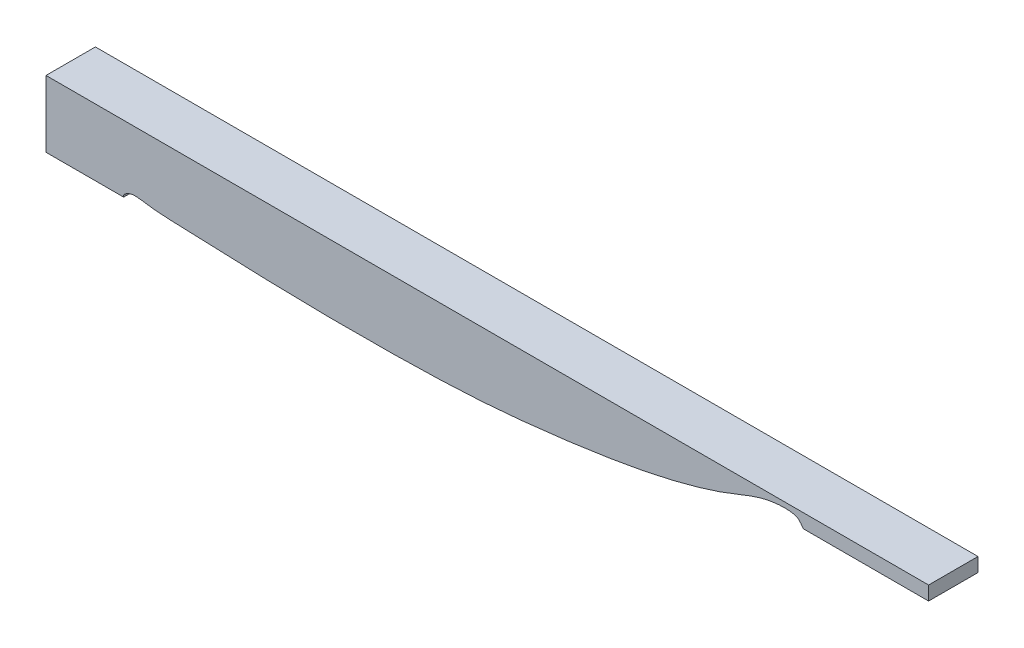
ISO-10303-21;
HEADER;
FILE_DESCRIPTION(('STEP AP214'),'2;1');
FILE_NAME('part.step','',(''),(''),'','','');
FILE_SCHEMA(('AUTOMOTIVE_DESIGN { 1 0 10303 214 1 1 1 1 }'));
ENDSEC;
DATA;
#1=APPLICATION_CONTEXT('core data for automotive mechanical design processes');
#2=APPLICATION_PROTOCOL_DEFINITION('international standard','automotive_design',2000,#1);
#3=PRODUCT_CONTEXT('',#1,'mechanical');
#4=PRODUCT('Part','Part','',(#3));
#5=PRODUCT_RELATED_PRODUCT_CATEGORY('part','',(#4));
#6=PRODUCT_DEFINITION_FORMATION('','',#4);
#7=PRODUCT_DEFINITION_CONTEXT('part definition',#1,'design');
#8=PRODUCT_DEFINITION('design','',#6,#7);
#9=PRODUCT_DEFINITION_SHAPE('','',#8);
#10=(LENGTH_UNIT() NAMED_UNIT(*) SI_UNIT(.MILLI.,.METRE.));
#11=(NAMED_UNIT(*) PLANE_ANGLE_UNIT() SI_UNIT($,.RADIAN.));
#12=(NAMED_UNIT(*) SI_UNIT($,.STERADIAN.) SOLID_ANGLE_UNIT());
#13=UNCERTAINTY_MEASURE_WITH_UNIT(LENGTH_MEASURE(1.E-05),#10,'distance_accuracy_value','');
#14=(GEOMETRIC_REPRESENTATION_CONTEXT(3) GLOBAL_UNCERTAINTY_ASSIGNED_CONTEXT((#13)) GLOBAL_UNIT_ASSIGNED_CONTEXT((#10,
#11,#12)) REPRESENTATION_CONTEXT('',''));
#15=CARTESIAN_POINT('',(0.,0.,0.));
#16=DIRECTION('',(0.,0.,1.));
#17=DIRECTION('',(1.,0.,0.));
#18=AXIS2_PLACEMENT_3D('',#15,#16,#17);
#19=CARTESIAN_POINT('',(-68.2489484839727,-8.52605292965796,476.));
#20=CARTESIAN_POINT('',(-68.2533247923052,-8.4529023843003,476.));
#21=CARTESIAN_POINT('',(-68.2569322805552,-8.37972342049867,476.));
#22=CARTESIAN_POINT('',(-68.2343163521224,-8.23226283192259,476.));
#23=CARTESIAN_POINT('',(-68.2080207293459,-8.16138844231768,476.));
#24=CARTESIAN_POINT('',(-68.127205135676,-8.03800988249847,476.));
#25=CARTESIAN_POINT('',(-68.0705011138666,-7.98776429052485,476.));
#26=CARTESIAN_POINT('',(-67.9482158781483,-7.90493004226665,476.));
#27=CARTESIAN_POINT('',(-67.884204442002,-7.86774868673432,476.));
#28=CARTESIAN_POINT('',(-67.5668208352467,-7.67825343060356,476.));
#29=CARTESIAN_POINT('',(-67.2971203980184,-7.54852209465641,476.));
#30=CARTESIAN_POINT('',(-66.7315049901243,-7.42235765275631,476.));
#31=CARTESIAN_POINT('',(-66.4339173476953,-7.41421867884997,476.));
#32=CARTESIAN_POINT('',(-65.8491519753092,-7.4418418646999,476.));
#33=CARTESIAN_POINT('',(-65.5583082346722,-7.47586883696786,476.));
#34=CARTESIAN_POINT('',(-64.9776596182763,-7.55756916912911,476.));
#35=CARTESIAN_POINT('',(-64.6878259473411,-7.60558858902924,476.));
#36=CARTESIAN_POINT('',(-64.1073487239561,-7.68947349176511,476.));
#37=CARTESIAN_POINT('',(-63.8167773241377,-7.72625422834563,476.));
#38=CARTESIAN_POINT('',(-62.9441617010869,-7.82261489506019,476.));
#39=CARTESIAN_POINT('',(-62.3611726505844,-7.86754006887502,476.));
#40=CARTESIAN_POINT('',(-61.1937781088705,-7.93542069348066,476.));
#41=CARTESIAN_POINT('',(-60.6095243307638,-7.96072929246214,476.));
#42=CARTESIAN_POINT('',(-59.4410020774088,-8.01111853020813,476.));
#43=CARTESIAN_POINT('',(-58.8567673535564,-8.03672267046187,476.));
#44=CARTESIAN_POINT('',(-57.1038410778341,-8.11009014152662,476.));
#45=CARTESIAN_POINT('',(-55.9349310917602,-8.15448744910708,476.));
#46=CARTESIAN_POINT('',(-52.4281269451959,-8.28639460573356,476.));
#47=CARTESIAN_POINT('',(-50.0901506244311,-8.37165275997234,476.));
#48=CARTESIAN_POINT('',(-45.4136421465843,-8.52564087746645,476.));
#49=CARTESIAN_POINT('',(-43.0750931348111,-8.59424462831321,476.));
#50=CARTESIAN_POINT('',(-38.3971672172672,-8.6947301961758,476.));
#51=CARTESIAN_POINT('',(-36.0579224010292,-8.72610347480661,476.));
#52=CARTESIAN_POINT('',(-31.3799470134702,-8.74952805701792,476.));
#53=CARTESIAN_POINT('',(-29.04105756508,-8.74229627148272,476.));
#54=CARTESIAN_POINT('',(-24.3634389426365,-8.69692794912191,476.));
#55=CARTESIAN_POINT('',(-22.0247086278698,-8.65901136930994,476.));
#56=CARTESIAN_POINT('',(-17.3474943370252,-8.53567817904545,476.));
#57=CARTESIAN_POINT('',(-15.0095135558156,-8.44877289023829,476.));
#58=CARTESIAN_POINT('',(-10.3385677126265,-8.19096370774135,476.));
#59=CARTESIAN_POINT('',(-8.00466935444032,-8.01945498111064,476.));
#60=CARTESIAN_POINT('',(-3.34540906826943,-7.59507370090841,476.));
#61=CARTESIAN_POINT('',(-1.01975021087461,-7.34413874672655,476.));
#62=CARTESIAN_POINT('',(3.62547515267916,-6.78283116800662,476.));
#63=CARTESIAN_POINT('',(5.94419277189459,-6.471592694492,476.));
#64=CARTESIAN_POINT('',(10.5707880283356,-5.77839263563608,476.));
#65=CARTESIAN_POINT('',(12.8803568834181,-5.39819157328985,476.));
#66=CARTESIAN_POINT('',(16.326183490577,-4.74214811288934,476.));
#67=CARTESIAN_POINT('',(17.4716503896121,-4.50866132848567,476.));
#68=CARTESIAN_POINT('',(19.7546149284383,-4.00413491527338,476.));
#69=CARTESIAN_POINT('',(20.8920173015602,-3.73264636965838,476.));
#70=CARTESIAN_POINT('',(23.1586602693669,-3.15120924264154,476.));
#71=CARTESIAN_POINT('',(24.2870475885936,-2.8420202123151,476.));
#72=CARTESIAN_POINT('',(26.5262576086589,-2.17443590813453,476.));
#73=CARTESIAN_POINT('',(27.6373844588649,-1.81531806968745,476.));
#74=CARTESIAN_POINT('',(29.285467265012,-1.22105767859637,476.));
#75=CARTESIAN_POINT('',(29.8318705434838,-1.01413586396761,476.));
#76=CARTESIAN_POINT('',(30.9215346744231,-0.590905280818656,476.));
#77=CARTESIAN_POINT('',(31.4642750736003,-0.373041830968047,476.));
#78=CARTESIAN_POINT('',(33.0959248206747,0.270306865659442,476.));
#79=CARTESIAN_POINT('',(34.1887658249609,0.682630155201133,476.));
#80=CARTESIAN_POINT('',(35.8788375571744,1.11053801745161,476.));
#81=CARTESIAN_POINT('',(36.4509588854229,1.22057047370641,476.));
#82=CARTESIAN_POINT('',(37.6130875473695,1.3740971914594,476.));
#83=CARTESIAN_POINT('',(38.200973147102,1.41854803960179,476.));
#84=CARTESIAN_POINT('',(39.0779210097481,1.4207765970405,476.));
#85=CARTESIAN_POINT('',(39.3701295030316,1.41096266504218,476.));
#86=CARTESIAN_POINT('',(39.808104996695,1.36311125118622,476.));
#87=CARTESIAN_POINT('',(39.954248269196,1.3419052642149,476.));
#88=CARTESIAN_POINT('',(40.2455457028879,1.28635814145551,476.));
#89=CARTESIAN_POINT('',(40.3890474710452,1.25177477447541,476.));
#90=CARTESIAN_POINT('',(40.6684624429664,1.15853822991436,476.));
#91=CARTESIAN_POINT('',(40.8064381692895,1.09808769108441,476.));
#92=CARTESIAN_POINT('',(41.0559135545449,0.939955740168489,476.));
#93=CARTESIAN_POINT('',(41.1648525861496,0.840247216639476,476.));
#94=CARTESIAN_POINT('',(41.3646016065332,0.619447769076702,476.));
#95=CARTESIAN_POINT('',(41.4527347755819,0.49988995495562,476.));
#96=CARTESIAN_POINT('',(41.5906746836864,0.325030478163939,476.));
#97=CARTESIAN_POINT('',(41.6368590336354,0.266903400041853,476.));
#98=CARTESIAN_POINT('',(41.7180659142962,0.141943172857215,476.));
#99=CARTESIAN_POINT('',(41.7507056010281,0.0744698271681527,476.));
#100=CARTESIAN_POINT('',(41.7619942007256,-1.36030103197252E-13,476.));
#101=B_SPLINE_CURVE_WITH_KNOTS('',3,(#19,#20,#21,#22,#23,#24,#25,#26,#27,#28,#29,#30,#31,#32,
#33,#34,#35,#36,#37,#38,#39,#40,#41,#42,#43,#44,#45,#46,#47,#48,#49,#50,#51,#52,#53,#54,#55,#56,
#57,#58,#59,#60,#61,#62,#63,#64,#65,#66,#67,#68,#69,#70,#71,#72,#73,#74,#75,#76,#77,#78,#79,#80,
#81,#82,#83,#84,#85,#86,#87,#88,#89,#90,#91,#92,#93,#94,#95,#96,#97,#98,#99,#100),.UNSPECIFIED.,
.F.,.F.,(4,2,2,2,2,2,2,2,2,2,2,2,2,2,2,2,2,2,2,2,2,2,2,2,2,2,2,2,2,2,2,2,2,2,2,2,2,2,2,2,4),(0.,
0.00195312499999989,0.00390624999999978,0.00585937499999967,0.00781249999999956,
0.0156249999999996,0.0234374999999996,0.0312499999999996,0.0390624999999996,0.0468749999999996,
0.0624999999999997,0.0781249999999997,0.0937499999999997,0.125,0.1875,0.25,0.3125,0.375,0.4375,
0.5,0.5625,0.625,0.6875,0.75,0.78125,0.8125,0.84375,0.875,0.890625,0.90625,0.9375,0.953125,
0.96875,0.9765625,0.98046875,0.984375,0.98828125,0.9921875,0.99609375,0.998046875,1.),.UNSPECIFIED.);
#102=DIRECTION('',(0.,0.,-1.));
#103=VECTOR('',#102,1.);
#104=SURFACE_OF_LINEAR_EXTRUSION('',#101,#103);
#105=CARTESIAN_POINT('',(-68.2489484839727,-8.52605292965796,468.));
#106=CARTESIAN_POINT('',(-68.2533247923052,-8.4529023843003,468.));
#107=CARTESIAN_POINT('',(-68.2569322805552,-8.37972342049867,468.));
#108=CARTESIAN_POINT('',(-68.2343163521224,-8.23226283192259,468.));
#109=CARTESIAN_POINT('',(-68.2080207293459,-8.16138844231768,468.));
#110=CARTESIAN_POINT('',(-68.127205135676,-8.03800988249847,468.));
#111=CARTESIAN_POINT('',(-68.0705011138666,-7.98776429052485,468.));
#112=CARTESIAN_POINT('',(-67.9482158781483,-7.90493004226665,468.));
#113=CARTESIAN_POINT('',(-67.884204442002,-7.86774868673432,468.));
#114=CARTESIAN_POINT('',(-67.5668208352467,-7.67825343060356,468.));
#115=CARTESIAN_POINT('',(-67.2971203980184,-7.54852209465641,468.));
#116=CARTESIAN_POINT('',(-66.7315049901243,-7.42235765275631,468.));
#117=CARTESIAN_POINT('',(-66.4339173476953,-7.41421867884997,468.));
#118=CARTESIAN_POINT('',(-65.8491519753092,-7.4418418646999,468.));
#119=CARTESIAN_POINT('',(-65.5583082346722,-7.47586883696786,468.));
#120=CARTESIAN_POINT('',(-64.9776596182763,-7.55756916912911,468.));
#121=CARTESIAN_POINT('',(-64.6878259473411,-7.60558858902924,468.));
#122=CARTESIAN_POINT('',(-64.1073487239561,-7.68947349176511,468.));
#123=CARTESIAN_POINT('',(-63.8167773241377,-7.72625422834563,468.));
#124=CARTESIAN_POINT('',(-62.9441617010869,-7.82261489506019,468.));
#125=CARTESIAN_POINT('',(-62.3611726505844,-7.86754006887502,468.));
#126=CARTESIAN_POINT('',(-61.1937781088705,-7.93542069348066,468.));
#127=CARTESIAN_POINT('',(-60.6095243307638,-7.96072929246214,468.));
#128=CARTESIAN_POINT('',(-59.4410020774088,-8.01111853020813,468.));
#129=CARTESIAN_POINT('',(-58.8567673535564,-8.03672267046187,468.));
#130=CARTESIAN_POINT('',(-57.1038410778341,-8.11009014152662,468.));
#131=CARTESIAN_POINT('',(-55.9349310917602,-8.15448744910708,468.));
#132=CARTESIAN_POINT('',(-52.4281269451959,-8.28639460573356,468.));
#133=CARTESIAN_POINT('',(-50.0901506244311,-8.37165275997234,468.));
#134=CARTESIAN_POINT('',(-45.4136421465843,-8.52564087746645,468.));
#135=CARTESIAN_POINT('',(-43.0750931348111,-8.59424462831321,468.));
#136=CARTESIAN_POINT('',(-38.3971672172672,-8.6947301961758,468.));
#137=CARTESIAN_POINT('',(-36.0579224010292,-8.72610347480661,468.));
#138=CARTESIAN_POINT('',(-31.3799470134702,-8.74952805701792,468.));
#139=CARTESIAN_POINT('',(-29.04105756508,-8.74229627148272,468.));
#140=CARTESIAN_POINT('',(-24.3634389426365,-8.69692794912191,468.));
#141=CARTESIAN_POINT('',(-22.0247086278698,-8.65901136930994,468.));
#142=CARTESIAN_POINT('',(-17.3474943370252,-8.53567817904545,468.));
#143=CARTESIAN_POINT('',(-15.0095135558156,-8.44877289023829,468.));
#144=CARTESIAN_POINT('',(-10.3385677126265,-8.19096370774135,468.));
#145=CARTESIAN_POINT('',(-8.00466935444032,-8.01945498111064,468.));
#146=CARTESIAN_POINT('',(-3.34540906826943,-7.59507370090841,468.));
#147=CARTESIAN_POINT('',(-1.01975021087461,-7.34413874672655,468.));
#148=CARTESIAN_POINT('',(3.62547515267916,-6.78283116800662,468.));
#149=CARTESIAN_POINT('',(5.94419277189459,-6.471592694492,468.));
#150=CARTESIAN_POINT('',(10.5707880283356,-5.77839263563608,468.));
#151=CARTESIAN_POINT('',(12.8803568834181,-5.39819157328985,468.));
#152=CARTESIAN_POINT('',(16.326183490577,-4.74214811288934,468.));
#153=CARTESIAN_POINT('',(17.4716503896121,-4.50866132848567,468.));
#154=CARTESIAN_POINT('',(19.7546149284383,-4.00413491527338,468.));
#155=CARTESIAN_POINT('',(20.8920173015602,-3.73264636965838,468.));
#156=CARTESIAN_POINT('',(23.1586602693669,-3.15120924264154,468.));
#157=CARTESIAN_POINT('',(24.2870475885936,-2.8420202123151,468.));
#158=CARTESIAN_POINT('',(26.5262576086589,-2.17443590813453,468.));
#159=CARTESIAN_POINT('',(27.6373844588649,-1.81531806968745,468.));
#160=CARTESIAN_POINT('',(29.285467265012,-1.22105767859637,468.));
#161=CARTESIAN_POINT('',(29.8318705434838,-1.01413586396761,468.));
#162=CARTESIAN_POINT('',(30.9215346744231,-0.590905280818656,468.));
#163=CARTESIAN_POINT('',(31.4642750736003,-0.373041830968047,468.));
#164=CARTESIAN_POINT('',(33.0959248206747,0.270306865659442,468.));
#165=CARTESIAN_POINT('',(34.1887658249609,0.682630155201133,468.));
#166=CARTESIAN_POINT('',(35.8788375571744,1.11053801745161,468.));
#167=CARTESIAN_POINT('',(36.4509588854229,1.22057047370641,468.));
#168=CARTESIAN_POINT('',(37.6130875473695,1.3740971914594,468.));
#169=CARTESIAN_POINT('',(38.200973147102,1.41854803960179,468.));
#170=CARTESIAN_POINT('',(39.0779210097481,1.4207765970405,468.));
#171=CARTESIAN_POINT('',(39.3701295030316,1.41096266504218,468.));
#172=CARTESIAN_POINT('',(39.808104996695,1.36311125118622,468.));
#173=CARTESIAN_POINT('',(39.954248269196,1.3419052642149,468.));
#174=CARTESIAN_POINT('',(40.2455457028879,1.28635814145551,468.));
#175=CARTESIAN_POINT('',(40.3890474710452,1.25177477447541,468.));
#176=CARTESIAN_POINT('',(40.6684624429664,1.15853822991436,468.));
#177=CARTESIAN_POINT('',(40.8064381692895,1.09808769108441,468.));
#178=CARTESIAN_POINT('',(41.0559135545449,0.939955740168489,468.));
#179=CARTESIAN_POINT('',(41.1648525861496,0.840247216639476,468.));
#180=CARTESIAN_POINT('',(41.3646016065332,0.619447769076702,468.));
#181=CARTESIAN_POINT('',(41.4527347755819,0.49988995495562,468.));
#182=CARTESIAN_POINT('',(41.5906746836864,0.325030478163939,468.));
#183=CARTESIAN_POINT('',(41.6368590336354,0.266903400041853,468.));
#184=CARTESIAN_POINT('',(41.7180659142962,0.141943172857215,468.));
#185=CARTESIAN_POINT('',(41.7507056010281,0.0744698271681527,468.));
#186=CARTESIAN_POINT('',(41.7619942007256,-1.36030103197252E-13,468.));
#187=B_SPLINE_CURVE_WITH_KNOTS('',3,(#105,#106,#107,#108,#109,#110,#111,#112,#113,#114,#115,
#116,#117,#118,#119,#120,#121,#122,#123,#124,#125,#126,#127,#128,#129,#130,#131,#132,#133,#134,
#135,#136,#137,#138,#139,#140,#141,#142,#143,#144,#145,#146,#147,#148,#149,#150,#151,#152,#153,
#154,#155,#156,#157,#158,#159,#160,#161,#162,#163,#164,#165,#166,#167,#168,#169,#170,#171,#172,
#173,#174,#175,#176,#177,#178,#179,#180,#181,#182,#183,#184,#185,#186),.UNSPECIFIED.,.F.,.F.,(4,
2,2,2,2,2,2,2,2,2,2,2,2,2,2,2,2,2,2,2,2,2,2,2,2,2,2,2,2,2,2,2,2,2,2,2,2,2,2,2,4),(0.,
0.00195312499999989,0.00390624999999978,0.00585937499999967,0.00781249999999956,
0.0156249999999996,0.0234374999999996,0.0312499999999996,0.0390624999999996,0.0468749999999996,
0.0624999999999997,0.0781249999999997,0.0937499999999997,0.125,0.1875,0.25,0.3125,0.375,0.4375,
0.5,0.5625,0.625,0.6875,0.75,0.78125,0.8125,0.84375,0.875,0.890625,0.90625,0.9375,0.953125,
0.96875,0.9765625,0.98046875,0.984375,0.98828125,0.9921875,0.99609375,0.998046875,1.),.UNSPECIFIED.);
#188=CARTESIAN_POINT('',(-68.2489484839727,-8.52605292965794,468.));
#189=VERTEX_POINT('',#188);
#190=CARTESIAN_POINT('',(41.7619942007257,0.,468.));
#191=VERTEX_POINT('',#190);
#192=EDGE_CURVE('E165',#189,#191,#187,.T.);
#193=ORIENTED_EDGE('',*,*,#192,.T.);
#194=DIRECTION('',(0.,0.,-1.));
#195=VECTOR('',#194,1.);
#196=CARTESIAN_POINT('',(41.7619942007257,0.,476.));
#197=LINE('',#196,#195);
#198=CARTESIAN_POINT('',(41.7619942007257,0.,476.));
#199=VERTEX_POINT('',#198);
#200=EDGE_CURVE('E11',#199,#191,#197,.T.);
#201=ORIENTED_EDGE('',*,*,#200,.F.);
#202=CARTESIAN_POINT('',(41.7619942007256,-1.36030103197252E-13,476.));
#203=CARTESIAN_POINT('',(41.7507056010281,0.0744698271681527,476.));
#204=CARTESIAN_POINT('',(41.7180659142962,0.141943172857215,476.));
#205=CARTESIAN_POINT('',(41.6368590336354,0.266903400041853,476.));
#206=CARTESIAN_POINT('',(41.5906746836864,0.325030478163939,476.));
#207=CARTESIAN_POINT('',(41.4527347755819,0.49988995495562,476.));
#208=CARTESIAN_POINT('',(41.3646016065332,0.619447769076702,476.));
#209=CARTESIAN_POINT('',(41.1648525861496,0.840247216639476,476.));
#210=CARTESIAN_POINT('',(41.0559135545449,0.939955740168489,476.));
#211=CARTESIAN_POINT('',(40.8064381692895,1.09808769108441,476.));
#212=CARTESIAN_POINT('',(40.6684624429664,1.15853822991436,476.));
#213=CARTESIAN_POINT('',(40.3890474710452,1.25177477447541,476.));
#214=CARTESIAN_POINT('',(40.2455457028879,1.28635814145551,476.));
#215=CARTESIAN_POINT('',(39.954248269196,1.3419052642149,476.));
#216=CARTESIAN_POINT('',(39.808104996695,1.36311125118622,476.));
#217=CARTESIAN_POINT('',(39.3701295030316,1.41096266504218,476.));
#218=CARTESIAN_POINT('',(39.0779210097481,1.4207765970405,476.));
#219=CARTESIAN_POINT('',(38.200973147102,1.41854803960179,476.));
#220=CARTESIAN_POINT('',(37.6130875473695,1.3740971914594,476.));
#221=CARTESIAN_POINT('',(36.4509588854229,1.22057047370641,476.));
#222=CARTESIAN_POINT('',(35.8788375571744,1.11053801745161,476.));
#223=CARTESIAN_POINT('',(34.1887658249609,0.682630155201133,476.));
#224=CARTESIAN_POINT('',(33.0959248206747,0.270306865659442,476.));
#225=CARTESIAN_POINT('',(31.4642750736003,-0.373041830968047,476.));
#226=CARTESIAN_POINT('',(30.9215346744231,-0.590905280818656,476.));
#227=CARTESIAN_POINT('',(29.8318705434838,-1.01413586396761,476.));
#228=CARTESIAN_POINT('',(29.285467265012,-1.22105767859637,476.));
#229=CARTESIAN_POINT('',(27.6373844588649,-1.81531806968745,476.));
#230=CARTESIAN_POINT('',(26.5262576086589,-2.17443590813453,476.));
#231=CARTESIAN_POINT('',(24.2870475885936,-2.8420202123151,476.));
#232=CARTESIAN_POINT('',(23.1586602693669,-3.15120924264154,476.));
#233=CARTESIAN_POINT('',(20.8920173015602,-3.73264636965838,476.));
#234=CARTESIAN_POINT('',(19.7546149284383,-4.00413491527338,476.));
#235=CARTESIAN_POINT('',(17.4716503896121,-4.50866132848567,476.));
#236=CARTESIAN_POINT('',(16.326183490577,-4.74214811288934,476.));
#237=CARTESIAN_POINT('',(12.8803568834181,-5.39819157328985,476.));
#238=CARTESIAN_POINT('',(10.5707880283356,-5.77839263563608,476.));
#239=CARTESIAN_POINT('',(5.94419277189459,-6.471592694492,476.));
#240=CARTESIAN_POINT('',(3.62547515267916,-6.78283116800662,476.));
#241=CARTESIAN_POINT('',(-1.01975021087461,-7.34413874672655,476.));
#242=CARTESIAN_POINT('',(-3.34540906826943,-7.59507370090841,476.));
#243=CARTESIAN_POINT('',(-8.00466935444032,-8.01945498111064,476.));
#244=CARTESIAN_POINT('',(-10.3385677126265,-8.19096370774135,476.));
#245=CARTESIAN_POINT('',(-15.0095135558156,-8.44877289023829,476.));
#246=CARTESIAN_POINT('',(-17.3474943370252,-8.53567817904545,476.));
#247=CARTESIAN_POINT('',(-22.0247086278698,-8.65901136930994,476.));
#248=CARTESIAN_POINT('',(-24.3634389426365,-8.69692794912191,476.));
#249=CARTESIAN_POINT('',(-29.04105756508,-8.74229627148272,476.));
#250=CARTESIAN_POINT('',(-31.3799470134702,-8.74952805701792,476.));
#251=CARTESIAN_POINT('',(-36.0579224010292,-8.72610347480661,476.));
#252=CARTESIAN_POINT('',(-38.3971672172672,-8.6947301961758,476.));
#253=CARTESIAN_POINT('',(-43.0750931348111,-8.59424462831321,476.));
#254=CARTESIAN_POINT('',(-45.4136421465843,-8.52564087746645,476.));
#255=CARTESIAN_POINT('',(-50.0901506244311,-8.37165275997234,476.));
#256=CARTESIAN_POINT('',(-52.4281269451959,-8.28639460573356,476.));
#257=CARTESIAN_POINT('',(-55.9349310917602,-8.15448744910708,476.));
#258=CARTESIAN_POINT('',(-57.1038410778341,-8.11009014152662,476.));
#259=CARTESIAN_POINT('',(-58.8567673535564,-8.03672267046187,476.));
#260=CARTESIAN_POINT('',(-59.4410020774088,-8.01111853020813,476.));
#261=CARTESIAN_POINT('',(-60.6095243307638,-7.96072929246214,476.));
#262=CARTESIAN_POINT('',(-61.1937781088705,-7.93542069348066,476.));
#263=CARTESIAN_POINT('',(-62.3611726505844,-7.86754006887502,476.));
#264=CARTESIAN_POINT('',(-62.9441617010869,-7.82261489506019,476.));
#265=CARTESIAN_POINT('',(-63.8167773241377,-7.72625422834563,476.));
#266=CARTESIAN_POINT('',(-64.1073487239561,-7.68947349176511,476.));
#267=CARTESIAN_POINT('',(-64.6878259473411,-7.60558858902924,476.));
#268=CARTESIAN_POINT('',(-64.9776596182763,-7.55756916912911,476.));
#269=CARTESIAN_POINT('',(-65.5583082346722,-7.47586883696786,476.));
#270=CARTESIAN_POINT('',(-65.8491519753092,-7.4418418646999,476.));
#271=CARTESIAN_POINT('',(-66.4339173476953,-7.41421867884997,476.));
#272=CARTESIAN_POINT('',(-66.7315049901243,-7.42235765275631,476.));
#273=CARTESIAN_POINT('',(-67.2971203980184,-7.54852209465641,476.));
#274=CARTESIAN_POINT('',(-67.5668208352467,-7.67825343060356,476.));
#275=CARTESIAN_POINT('',(-67.884204442002,-7.86774868673432,476.));
#276=CARTESIAN_POINT('',(-67.9482158781483,-7.90493004226665,476.));
#277=CARTESIAN_POINT('',(-68.0705011138666,-7.98776429052485,476.));
#278=CARTESIAN_POINT('',(-68.127205135676,-8.03800988249847,476.));
#279=CARTESIAN_POINT('',(-68.2080207293459,-8.16138844231768,476.));
#280=CARTESIAN_POINT('',(-68.2343163521224,-8.23226283192259,476.));
#281=CARTESIAN_POINT('',(-68.2569322805552,-8.37972342049867,476.));
#282=CARTESIAN_POINT('',(-68.2533247923052,-8.4529023843003,476.));
#283=CARTESIAN_POINT('',(-68.2489484839727,-8.52605292965796,476.));
#284=B_SPLINE_CURVE_WITH_KNOTS('',3,(#202,#203,#204,#205,#206,#207,#208,#209,#210,#211,#212,
#213,#214,#215,#216,#217,#218,#219,#220,#221,#222,#223,#224,#225,#226,#227,#228,#229,#230,#231,
#232,#233,#234,#235,#236,#237,#238,#239,#240,#241,#242,#243,#244,#245,#246,#247,#248,#249,#250,
#251,#252,#253,#254,#255,#256,#257,#258,#259,#260,#261,#262,#263,#264,#265,#266,#267,#268,#269,
#270,#271,#272,#273,#274,#275,#276,#277,#278,#279,#280,#281,#282,#283),.UNSPECIFIED.,.F.,.F.,(4,
2,2,2,2,2,2,2,2,2,2,2,2,2,2,2,2,2,2,2,2,2,2,2,2,2,2,2,2,2,2,2,2,2,2,2,2,2,2,2,4),(0.,
0.001953125,0.00390625,0.0078125,0.01171875,0.015625,0.01953125,0.0234375,0.03125,0.046875,
0.0625000000000001,0.0937500000000001,0.109375,0.125,0.15625,0.1875,0.21875,0.25,0.3125,0.375,
0.4375,0.5,0.5625,0.625,0.6875,0.75,0.8125,0.875,0.90625,0.921875,0.9375,0.953125,0.9609375,
0.96875,0.9765625,0.984375,0.9921875,0.994140625,0.99609375,0.998046875,1.),.UNSPECIFIED.);
#285=CARTESIAN_POINT('',(-68.2489484839727,-8.52605292965794,476.));
#286=VERTEX_POINT('',#285);
#287=EDGE_CURVE('E129',#286,#199,#284,.F.);
#288=ORIENTED_EDGE('',*,*,#287,.F.);
#289=DIRECTION('',(0.,0.,-1.));
#290=VECTOR('',#289,1.);
#291=CARTESIAN_POINT('',(-68.2489484839727,-8.52605292965794,476.));
#292=LINE('',#291,#290);
#293=EDGE_CURVE('E114',#286,#189,#292,.T.);
#294=ORIENTED_EDGE('',*,*,#293,.T.);
#295=EDGE_LOOP('',(#193,#201,#288,#294));
#296=FACE_BOUND('',#295,.T.);
#297=ADVANCED_FACE('F30',(#296),#104,.F.);
#298=CARTESIAN_POINT('',(41.7619942007257,0.,476.));
#299=DIRECTION('',(0.,1.,0.));
#300=DIRECTION('',(-1.,0.,0.));
#301=AXIS2_PLACEMENT_3D('',#298,#299,#300);
#302=PLANE('',#301);
#303=DIRECTION('',(1.,0.,0.));
#304=VECTOR('',#303,1.);
#305=CARTESIAN_POINT('',(41.7619942007257,0.,468.));
#306=LINE('',#305,#304);
#307=CARTESIAN_POINT('',(62.1050488176006,0.,468.));
#308=VERTEX_POINT('',#307);
#309=EDGE_CURVE('E120',#191,#308,#306,.T.);
#310=ORIENTED_EDGE('',*,*,#309,.T.);
#311=DIRECTION('',(0.,0.,-1.));
#312=VECTOR('',#311,1.);
#313=CARTESIAN_POINT('',(62.1050488176006,0.,476.));
#314=LINE('',#313,#312);
#315=CARTESIAN_POINT('',(62.1050488176006,0.,476.));
#316=VERTEX_POINT('',#315);
#317=EDGE_CURVE('E41',#316,#308,#314,.T.);
#318=ORIENTED_EDGE('',*,*,#317,.F.);
#319=DIRECTION('',(1.,0.,0.));
#320=VECTOR('',#319,1.);
#321=CARTESIAN_POINT('',(41.7619942007257,0.,476.));
#322=LINE('',#321,#320);
#323=EDGE_CURVE('E87',#199,#316,#322,.T.);
#324=ORIENTED_EDGE('',*,*,#323,.F.);
#325=ORIENTED_EDGE('',*,*,#200,.T.);
#326=EDGE_LOOP('',(#310,#318,#324,#325));
#327=FACE_BOUND('',#326,.T.);
#328=ADVANCED_FACE('F199',(#327),#302,.F.);
#329=CARTESIAN_POINT('',(62.1050488176006,2.25600000000005,476.));
#330=DIRECTION('',(-1.,0.,0.));
#331=DIRECTION('',(0.,0.,1.));
#332=AXIS2_PLACEMENT_3D('',#329,#330,#331);
#333=PLANE('',#332);
#334=DIRECTION('',(0.,1.,0.));
#335=VECTOR('',#334,1.);
#336=CARTESIAN_POINT('',(62.1050488176006,2.25600000000005,468.));
#337=LINE('',#336,#335);
#338=CARTESIAN_POINT('',(62.1050488176006,2.25600000000005,468.));
#339=VERTEX_POINT('',#338);
#340=EDGE_CURVE('E118',#308,#339,#337,.T.);
#341=ORIENTED_EDGE('',*,*,#340,.T.);
#342=DIRECTION('',(0.,0.,-1.));
#343=VECTOR('',#342,1.);
#344=CARTESIAN_POINT('',(62.1050488176006,2.25600000000005,476.));
#345=LINE('',#344,#343);
#346=CARTESIAN_POINT('',(62.1050488176006,2.25600000000005,476.));
#347=VERTEX_POINT('',#346);
#348=EDGE_CURVE('E109',#347,#339,#345,.T.);
#349=ORIENTED_EDGE('',*,*,#348,.F.);
#350=DIRECTION('',(0.,1.,0.));
#351=VECTOR('',#350,1.);
#352=CARTESIAN_POINT('',(62.1050488176006,2.25600000000005,476.));
#353=LINE('',#352,#351);
#354=EDGE_CURVE('E100',#316,#347,#353,.T.);
#355=ORIENTED_EDGE('',*,*,#354,.F.);
#356=ORIENTED_EDGE('',*,*,#317,.T.);
#357=EDGE_LOOP('',(#341,#349,#355,#356));
#358=FACE_BOUND('',#357,.T.);
#359=ADVANCED_FACE('F202',(#358),#333,.F.);
#360=CARTESIAN_POINT('',(62.1050488176006,2.25600000000005,476.));
#361=DIRECTION('',(0.,-1.,0.));
#362=DIRECTION('',(1.,0.,0.));
#363=AXIS2_PLACEMENT_3D('',#360,#361,#362);
#364=PLANE('',#363);
#365=DIRECTION('',(-1.,0.,0.));
#366=VECTOR('',#365,1.);
#367=CARTESIAN_POINT('',(62.1050488176006,2.25600000000005,468.));
#368=LINE('',#367,#366);
#369=CARTESIAN_POINT('',(-80.8206732122275,2.25600000000003,468.));
#370=VERTEX_POINT('',#369);
#371=EDGE_CURVE('E108',#339,#370,#368,.T.);
#372=ORIENTED_EDGE('',*,*,#371,.T.);
#373=DIRECTION('',(0.,0.,-1.));
#374=VECTOR('',#373,1.);
#375=CARTESIAN_POINT('',(-80.8206732122275,2.25600000000003,476.));
#376=LINE('',#375,#374);
#377=CARTESIAN_POINT('',(-80.8206732122275,2.25600000000003,476.));
#378=VERTEX_POINT('',#377);
#379=EDGE_CURVE('E105',#378,#370,#376,.T.);
#380=ORIENTED_EDGE('',*,*,#379,.F.);
#381=DIRECTION('',(-1.,0.,0.));
#382=VECTOR('',#381,1.);
#383=CARTESIAN_POINT('',(62.1050488176006,2.25600000000005,476.));
#384=LINE('',#383,#382);
#385=EDGE_CURVE('E94',#347,#378,#384,.T.);
#386=ORIENTED_EDGE('',*,*,#385,.F.);
#387=ORIENTED_EDGE('',*,*,#348,.T.);
#388=EDGE_LOOP('',(#372,#380,#386,#387));
#389=FACE_BOUND('',#388,.T.);
#390=ADVANCED_FACE('F106',(#389),#364,.F.);
#391=CARTESIAN_POINT('',(-80.8206732122235,-8.52606122152262,476.));
#392=DIRECTION('',(1.,3.71977175241079E-13,0.));
#393=DIRECTION('',(-3.71977175241079E-13,1.,0.));
#394=AXIS2_PLACEMENT_3D('',#391,#392,#393);
#395=PLANE('',#394);
#396=DIRECTION('',(3.71977175241079E-13,-1.,0.));
#397=VECTOR('',#396,1.);
#398=CARTESIAN_POINT('',(-80.8206732122235,-8.52606122152262,468.));
#399=LINE('',#398,#397);
#400=CARTESIAN_POINT('',(-80.8206732122235,-8.52606122152262,468.));
#401=VERTEX_POINT('',#400);
#402=EDGE_CURVE('E73',#370,#401,#399,.T.);
#403=ORIENTED_EDGE('',*,*,#402,.T.);
#404=DIRECTION('',(0.,0.,-1.));
#405=VECTOR('',#404,1.);
#406=CARTESIAN_POINT('',(-80.8206732122235,-8.52606122152262,476.));
#407=LINE('',#406,#405);
#408=CARTESIAN_POINT('',(-80.8206732122235,-8.52606122152262,476.));
#409=VERTEX_POINT('',#408);
#410=EDGE_CURVE('E110',#409,#401,#407,.T.);
#411=ORIENTED_EDGE('',*,*,#410,.F.);
#412=DIRECTION('',(3.71977175241079E-13,-1.,0.));
#413=VECTOR('',#412,1.);
#414=CARTESIAN_POINT('',(-80.8206732122235,-8.52606122152262,476.));
#415=LINE('',#414,#413);
#416=EDGE_CURVE('E98',#378,#409,#415,.T.);
#417=ORIENTED_EDGE('',*,*,#416,.F.);
#418=ORIENTED_EDGE('',*,*,#379,.T.);
#419=EDGE_LOOP('',(#403,#411,#417,#418));
#420=FACE_BOUND('',#419,.T.);
#421=ADVANCED_FACE('F112',(#420),#395,.F.);
#422=CARTESIAN_POINT('',(-80.8206732122235,-8.52606122152262,476.));
#423=DIRECTION('',(-6.59564606826192E-07,0.999999999999783,0.));
#424=DIRECTION('',(-0.999999999999783,-6.59564606826192E-07,0.));
#425=AXIS2_PLACEMENT_3D('',#422,#423,#424);
#426=PLANE('',#425);
#427=DIRECTION('',(0.999999999999783,6.59564606826192E-07,0.));
#428=VECTOR('',#427,1.);
#429=CARTESIAN_POINT('',(-80.8206732122235,-8.52606122152262,468.));
#430=LINE('',#429,#428);
#431=EDGE_CURVE('E79',#401,#189,#430,.T.);
#432=ORIENTED_EDGE('',*,*,#431,.T.);
#433=ORIENTED_EDGE('',*,*,#293,.F.);
#434=DIRECTION('',(0.999999999999783,6.59564606826192E-07,0.));
#435=VECTOR('',#434,1.);
#436=CARTESIAN_POINT('',(-80.8206732122235,-8.52606122152262,476.));
#437=LINE('',#436,#435);
#438=EDGE_CURVE('E50',#409,#286,#437,.T.);
#439=ORIENTED_EDGE('',*,*,#438,.F.);
#440=ORIENTED_EDGE('',*,*,#410,.T.);
#441=EDGE_LOOP('',(#432,#433,#439,#440));
#442=FACE_BOUND('',#441,.T.);
#443=ADVANCED_FACE('F145',(#442),#426,.F.);
#444=CARTESIAN_POINT('',(-12.674040634221,-8.31986829898982,476.));
#445=DIRECTION('',(0.,0.,-1.));
#446=DIRECTION('',(-1.,0.,0.));
#447=AXIS2_PLACEMENT_3D('',#444,#445,#446);
#448=PLANE('',#447);
#449=ORIENTED_EDGE('',*,*,#287,.T.);
#450=ORIENTED_EDGE('',*,*,#323,.T.);
#451=ORIENTED_EDGE('',*,*,#354,.T.);
#452=ORIENTED_EDGE('',*,*,#385,.T.);
#453=ORIENTED_EDGE('',*,*,#416,.T.);
#454=ORIENTED_EDGE('',*,*,#438,.T.);
#455=EDGE_LOOP('',(#449,#450,#451,#452,#453,#454));
#456=FACE_BOUND('',#455,.T.);
#457=ADVANCED_FACE('F96',(#456),#448,.F.);
#458=CARTESIAN_POINT('',(-12.674040634221,-8.31986829898982,468.));
#459=DIRECTION('',(0.,0.,-1.));
#460=DIRECTION('',(-1.,0.,0.));
#461=AXIS2_PLACEMENT_3D('',#458,#459,#460);
#462=PLANE('',#461);
#463=ORIENTED_EDGE('',*,*,#192,.F.);
#464=ORIENTED_EDGE('',*,*,#431,.F.);
#465=ORIENTED_EDGE('',*,*,#402,.F.);
#466=ORIENTED_EDGE('',*,*,#371,.F.);
#467=ORIENTED_EDGE('',*,*,#340,.F.);
#468=ORIENTED_EDGE('',*,*,#309,.F.);
#469=EDGE_LOOP('',(#463,#464,#465,#466,#467,#468));
#470=FACE_BOUND('',#469,.T.);
#471=ADVANCED_FACE('F144',(#470),#462,.T.);
#472=CLOSED_SHELL('',(#297,#328,#359,#390,#421,#443,#457,#471));
#473=MANIFOLD_SOLID_BREP('B2',#472);
#474=ADVANCED_BREP_SHAPE_REPRESENTATION('',(#18,#473),#14);
#475=SHAPE_DEFINITION_REPRESENTATION(#9,#474);
ENDSEC;
END-ISO-10303-21;
